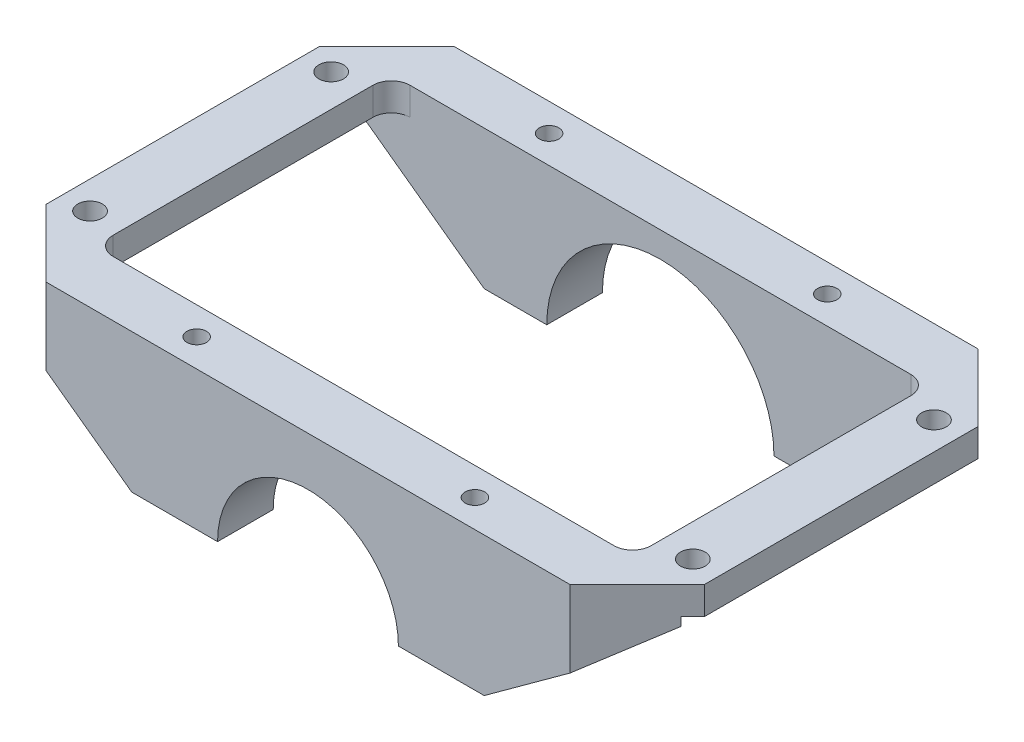
ISO-10303-21;
HEADER;
FILE_DESCRIPTION(('STEP AP214'),'2;1');
FILE_NAME('part.step','',(''),(''),'','','');
FILE_SCHEMA(('AUTOMOTIVE_DESIGN { 1 0 10303 214 1 1 1 1 }'));
ENDSEC;
DATA;
#1=APPLICATION_CONTEXT('core data for automotive mechanical design processes');
#2=APPLICATION_PROTOCOL_DEFINITION('international standard','automotive_design',2000,#1);
#3=PRODUCT_CONTEXT('',#1,'mechanical');
#4=PRODUCT('Part','Part','',(#3));
#5=PRODUCT_RELATED_PRODUCT_CATEGORY('part','',(#4));
#6=PRODUCT_DEFINITION_FORMATION('','',#4);
#7=PRODUCT_DEFINITION_CONTEXT('part definition',#1,'design');
#8=PRODUCT_DEFINITION('design','',#6,#7);
#9=PRODUCT_DEFINITION_SHAPE('','',#8);
#10=(LENGTH_UNIT() NAMED_UNIT(*) SI_UNIT(.MILLI.,.METRE.));
#11=(NAMED_UNIT(*) PLANE_ANGLE_UNIT() SI_UNIT($,.RADIAN.));
#12=(NAMED_UNIT(*) SI_UNIT($,.STERADIAN.) SOLID_ANGLE_UNIT());
#13=UNCERTAINTY_MEASURE_WITH_UNIT(LENGTH_MEASURE(1.E-05),#10,'distance_accuracy_value','');
#14=(GEOMETRIC_REPRESENTATION_CONTEXT(3) GLOBAL_UNCERTAINTY_ASSIGNED_CONTEXT((#13)) GLOBAL_UNIT_ASSIGNED_CONTEXT((#10,
#11,#12)) REPRESENTATION_CONTEXT('',''));
#15=CARTESIAN_POINT('',(0.,0.,0.));
#16=DIRECTION('',(0.,0.,1.));
#17=DIRECTION('',(1.,0.,0.));
#18=AXIS2_PLACEMENT_3D('',#15,#16,#17);
#19=CARTESIAN_POINT('',(-71.,-30.,44.));
#20=DIRECTION('',(0.,1.,0.));
#21=DIRECTION('',(0.,0.,1.));
#22=AXIS2_PLACEMENT_3D('',#19,#20,#21);
#23=PLANE('',#22);
#24=CARTESIAN_POINT('',(30.,-30.,-38.));
#25=DIRECTION('',(0.,1.,0.));
#26=DIRECTION('',(0.,0.,1.));
#27=AXIS2_PLACEMENT_3D('',#24,#25,#26);
#28=CIRCLE('',#27,2.09999999999999);
#29=CARTESIAN_POINT('',(30.,-30.,-35.9));
#30=VERTEX_POINT('',#29);
#31=EDGE_CURVE('E618',#30,#30,#28,.T.);
#32=ORIENTED_EDGE('',*,*,#31,.T.);
#33=EDGE_LOOP('',(#32));
#34=FACE_BOUND('',#33,.T.);
#35=DIRECTION('',(-1.,0.,0.));
#36=VECTOR('',#35,1.);
#37=CARTESIAN_POINT('',(-58.,-30.,-32.));
#38=LINE('',#37,#36);
#39=CARTESIAN_POINT('',(38.,-30.,-32.));
#40=VERTEX_POINT('',#39);
#41=CARTESIAN_POINT('',(24.5,-30.,-32.));
#42=VERTEX_POINT('',#41);
#43=EDGE_CURVE('E274',#40,#42,#38,.T.);
#44=ORIENTED_EDGE('',*,*,#43,.T.);
#45=DIRECTION('',(0.,0.,-1.));
#46=VECTOR('',#45,1.);
#47=CARTESIAN_POINT('',(24.5,-30.,44.001));
#48=LINE('',#47,#46);
#49=CARTESIAN_POINT('',(24.5,-30.,-44.));
#50=VERTEX_POINT('',#49);
#51=EDGE_CURVE('E59',#50,#42,#48,.F.);
#52=ORIENTED_EDGE('',*,*,#51,.F.);
#53=DIRECTION('',(-1.,0.,0.));
#54=VECTOR('',#53,1.);
#55=CARTESIAN_POINT('',(-71.,-30.,-44.));
#56=LINE('',#55,#54);
#57=CARTESIAN_POINT('',(38.,-30.,-44.));
#58=VERTEX_POINT('',#57);
#59=EDGE_CURVE('E272',#58,#50,#56,.T.);
#60=ORIENTED_EDGE('',*,*,#59,.F.);
#61=DIRECTION('',(0.,0.,1.));
#62=VECTOR('',#61,1.);
#63=CARTESIAN_POINT('',(38.,-30.,-44.));
#64=LINE('',#63,#62);
#65=EDGE_CURVE('E530',#58,#40,#64,.T.);
#66=ORIENTED_EDGE('',*,*,#65,.T.);
#67=EDGE_LOOP('',(#44,#52,#60,#66));
#68=FACE_BOUND('',#67,.T.);
#69=ADVANCED_FACE('F40',(#34,#68),#23,.F.);
#70=CARTESIAN_POINT('',(-30.,-30.,38.));
#71=DIRECTION('',(0.,1.,0.));
#72=DIRECTION('',(0.,0.,1.));
#73=AXIS2_PLACEMENT_3D('',#70,#71,#72);
#74=CIRCLE('',#73,2.09999999999999);
#75=CARTESIAN_POINT('',(-30.,-30.,40.1));
#76=VERTEX_POINT('',#75);
#77=EDGE_CURVE('E610',#76,#76,#74,.T.);
#78=ORIENTED_EDGE('',*,*,#77,.T.);
#79=EDGE_LOOP('',(#78));
#80=FACE_BOUND('',#79,.T.);
#81=DIRECTION('',(1.,0.,0.));
#82=VECTOR('',#81,1.);
#83=CARTESIAN_POINT('',(-58.,-30.,32.));
#84=LINE('',#83,#82);
#85=CARTESIAN_POINT('',(-38.,-30.,32.));
#86=VERTEX_POINT('',#85);
#87=CARTESIAN_POINT('',(-19.5,-30.,32.));
#88=VERTEX_POINT('',#87);
#89=EDGE_CURVE('E538',#86,#88,#84,.T.);
#90=ORIENTED_EDGE('',*,*,#89,.T.);
#91=DIRECTION('',(0.,0.,1.));
#92=VECTOR('',#91,1.);
#93=CARTESIAN_POINT('',(-19.5,-30.,-44.001));
#94=LINE('',#93,#92);
#95=CARTESIAN_POINT('',(-19.5,-30.,44.));
#96=VERTEX_POINT('',#95);
#97=EDGE_CURVE('E69',#96,#88,#94,.F.);
#98=ORIENTED_EDGE('',*,*,#97,.F.);
#99=DIRECTION('',(1.,0.,0.));
#100=VECTOR('',#99,1.);
#101=CARTESIAN_POINT('',(-71.,-30.,44.));
#102=LINE('',#101,#100);
#103=CARTESIAN_POINT('',(-38.,-30.,44.));
#104=VERTEX_POINT('',#103);
#105=EDGE_CURVE('E292',#104,#96,#102,.T.);
#106=ORIENTED_EDGE('',*,*,#105,.F.);
#107=DIRECTION('',(0.,0.,1.));
#108=VECTOR('',#107,1.);
#109=CARTESIAN_POINT('',(-38.,-30.,-44.));
#110=LINE('',#109,#108);
#111=EDGE_CURVE('E513',#86,#104,#110,.T.);
#112=ORIENTED_EDGE('',*,*,#111,.F.);
#113=EDGE_LOOP('',(#90,#98,#106,#112));
#114=FACE_BOUND('',#113,.T.);
#115=ADVANCED_FACE('F588',(#80,#114),#23,.F.);
#116=CARTESIAN_POINT('',(-58.,-30.,-32.));
#117=DIRECTION('',(-1.,0.,0.));
#118=DIRECTION('',(0.,0.,1.));
#119=AXIS2_PLACEMENT_3D('',#116,#117,#118);
#120=PLANE('',#119);
#121=DIRECTION('',(0.,0.,1.));
#122=VECTOR('',#121,1.);
#123=CARTESIAN_POINT('',(-58.,0.,-32.));
#124=LINE('',#123,#122);
#125=CARTESIAN_POINT('',(-58.,0.,-28.));
#126=VERTEX_POINT('',#125);
#127=CARTESIAN_POINT('',(-58.,0.,28.));
#128=VERTEX_POINT('',#127);
#129=EDGE_CURVE('E537',#126,#128,#124,.T.);
#130=ORIENTED_EDGE('',*,*,#129,.T.);
#131=DIRECTION('',(0.,1.,0.));
#132=VECTOR('',#131,1.);
#133=CARTESIAN_POINT('',(-58.,-6.00000000000001,28.));
#134=LINE('',#133,#132);
#135=CARTESIAN_POINT('',(-58.,-6.00000000000001,28.));
#136=VERTEX_POINT('',#135);
#137=EDGE_CURVE('E338',#128,#136,#134,.F.);
#138=ORIENTED_EDGE('',*,*,#137,.T.);
#139=DIRECTION('',(0.,0.,1.));
#140=VECTOR('',#139,1.);
#141=CARTESIAN_POINT('',(-58.,-6.00000000000001,-32.));
#142=LINE('',#141,#140);
#143=CARTESIAN_POINT('',(-58.,-6.00000000000001,-28.));
#144=VERTEX_POINT('',#143);
#145=EDGE_CURVE('E509',#144,#136,#142,.T.);
#146=ORIENTED_EDGE('',*,*,#145,.F.);
#147=DIRECTION('',(0.,1.,0.));
#148=VECTOR('',#147,1.);
#149=CARTESIAN_POINT('',(-58.,0.,-28.));
#150=LINE('',#149,#148);
#151=EDGE_CURVE('E335',#144,#126,#150,.T.);
#152=ORIENTED_EDGE('',*,*,#151,.T.);
#153=EDGE_LOOP('',(#130,#138,#146,#152));
#154=FACE_BOUND('',#153,.T.);
#155=ADVANCED_FACE('F688',(#154),#120,.F.);
#156=CARTESIAN_POINT('',(58.,-30.,-32.));
#157=DIRECTION('',(1.,0.,0.));
#158=DIRECTION('',(0.,0.,-1.));
#159=AXIS2_PLACEMENT_3D('',#156,#157,#158);
#160=PLANE('',#159);
#161=DIRECTION('',(0.,0.,-1.));
#162=VECTOR('',#161,1.);
#163=CARTESIAN_POINT('',(58.,-6.00000000000001,-32.));
#164=LINE('',#163,#162);
#165=CARTESIAN_POINT('',(58.,-6.00000000000001,28.));
#166=VERTEX_POINT('',#165);
#167=CARTESIAN_POINT('',(58.,-6.00000000000001,-28.));
#168=VERTEX_POINT('',#167);
#169=EDGE_CURVE('E501',#166,#168,#164,.T.);
#170=ORIENTED_EDGE('',*,*,#169,.F.);
#171=DIRECTION('',(0.,1.,0.));
#172=VECTOR('',#171,1.);
#173=CARTESIAN_POINT('',(58.,0.,28.));
#174=LINE('',#173,#172);
#175=CARTESIAN_POINT('',(58.,0.,28.));
#176=VERTEX_POINT('',#175);
#177=EDGE_CURVE('E317',#166,#176,#174,.T.);
#178=ORIENTED_EDGE('',*,*,#177,.T.);
#179=DIRECTION('',(0.,0.,-1.));
#180=VECTOR('',#179,1.);
#181=CARTESIAN_POINT('',(58.,0.,-32.));
#182=LINE('',#181,#180);
#183=CARTESIAN_POINT('',(58.,0.,-28.));
#184=VERTEX_POINT('',#183);
#185=EDGE_CURVE('E553',#176,#184,#182,.T.);
#186=ORIENTED_EDGE('',*,*,#185,.T.);
#187=DIRECTION('',(0.,1.,0.));
#188=VECTOR('',#187,1.);
#189=CARTESIAN_POINT('',(58.,-6.00000000000001,-28.));
#190=LINE('',#189,#188);
#191=EDGE_CURVE('E314',#184,#168,#190,.F.);
#192=ORIENTED_EDGE('',*,*,#191,.T.);
#193=EDGE_LOOP('',(#170,#178,#186,#192));
#194=FACE_BOUND('',#193,.T.);
#195=ADVANCED_FACE('F736',(#194),#160,.F.);
#196=CARTESIAN_POINT('',(-33.4843062845935,-81.9885863887953,-44.));
#197=DIRECTION('',(-0.588171697675047,0.808736084303188,0.));
#198=DIRECTION('',(-0.808736084303188,-0.588171697675047,0.));
#199=AXIS2_PLACEMENT_3D('',#196,#197,#198);
#200=PLANE('',#199);
#201=DIRECTION('',(-0.808736084303188,-0.588171697675047,0.));
#202=VECTOR('',#201,1.);
#203=CARTESIAN_POINT('',(-33.4843062845935,-81.9885863887953,-44.));
#204=LINE('',#203,#202);
#205=CARTESIAN_POINT('',(56.5,-16.5454545454546,-44.));
#206=VERTEX_POINT('',#205);
#207=EDGE_CURVE('E279',#206,#58,#204,.T.);
#208=ORIENTED_EDGE('',*,*,#207,.F.);
#209=DIRECTION('',(-0.628828145522533,-0.457329560380024,-0.628828145522532));
#210=VECTOR('',#209,1.);
#211=CARTESIAN_POINT('',(64.0980392156863,-11.0196078431373,-36.4019607843137));
#212=LINE('',#211,#210);
#213=CARTESIAN_POINT('',(68.4999999999999,-7.81818181818182,-32.));
#214=VERTEX_POINT('',#213);
#215=EDGE_CURVE('E406',#206,#214,#212,.F.);
#216=ORIENTED_EDGE('',*,*,#215,.T.);
#217=DIRECTION('',(0.808736084303188,0.588171697675047,0.));
#218=VECTOR('',#217,1.);
#219=CARTESIAN_POINT('',(-24.7891891891892,-75.6648648648649,-32.));
#220=LINE('',#219,#218);
#221=EDGE_CURVE('E533',#40,#214,#220,.T.);
#222=ORIENTED_EDGE('',*,*,#221,.F.);
#223=ORIENTED_EDGE('',*,*,#65,.F.);
#224=EDGE_LOOP('',(#208,#216,#222,#223));
#225=FACE_BOUND('',#224,.T.);
#226=ADVANCED_FACE('F606',(#225),#200,.F.);
#227=CARTESIAN_POINT('',(-71.,-6.,-44.));
#228=DIRECTION('',(-0.588171697675047,-0.808736084303189,0.));
#229=DIRECTION('',(0.808736084303188,-0.588171697675046,0.));
#230=AXIS2_PLACEMENT_3D('',#227,#228,#229);
#231=PLANE('',#230);
#232=DIRECTION('',(-0.808736084303188,0.588171697675046,0.));
#233=VECTOR('',#232,1.);
#234=CARTESIAN_POINT('',(-51.0810810810811,-20.4864864864865,-32.));
#235=LINE('',#234,#233);
#236=CARTESIAN_POINT('',(-38.,-30.,-32.));
#237=VERTEX_POINT('',#236);
#238=CARTESIAN_POINT('',(-68.4999999999999,-7.81818181818185,-32.));
#239=VERTEX_POINT('',#238);
#240=EDGE_CURVE('E520',#237,#239,#235,.T.);
#241=ORIENTED_EDGE('',*,*,#240,.T.);
#242=DIRECTION('',(-0.628828145522533,0.457329560380024,0.628828145522532));
#243=VECTOR('',#242,1.);
#244=CARTESIAN_POINT('',(-65.266339869281,-10.1699346405229,-35.2336601307189));
#245=LINE('',#244,#243);
#246=CARTESIAN_POINT('',(-56.4999999999999,-16.5454545454546,-44.));
#247=VERTEX_POINT('',#246);
#248=EDGE_CURVE('E11',#239,#247,#245,.F.);
#249=ORIENTED_EDGE('',*,*,#248,.T.);
#250=DIRECTION('',(0.808736084303188,-0.588171697675046,0.));
#251=VECTOR('',#250,1.);
#252=CARTESIAN_POINT('',(-71.,-6.,-44.));
#253=LINE('',#252,#251);
#254=CARTESIAN_POINT('',(-38.,-30.,-44.));
#255=VERTEX_POINT('',#254);
#256=EDGE_CURVE('E481',#247,#255,#253,.T.);
#257=ORIENTED_EDGE('',*,*,#256,.T.);
#258=EDGE_CURVE('E514',#255,#237,#110,.T.);
#259=ORIENTED_EDGE('',*,*,#258,.T.);
#260=EDGE_LOOP('',(#241,#249,#257,#259));
#261=FACE_BOUND('',#260,.T.);
#262=ADVANCED_FACE('F727',(#261),#231,.T.);
#263=CARTESIAN_POINT('',(-71.,-30.,-44.));
#264=DIRECTION('',(-1.,0.,0.));
#265=DIRECTION('',(0.,0.,1.));
#266=AXIS2_PLACEMENT_3D('',#263,#264,#265);
#267=PLANE('',#266);
#268=DIRECTION('',(0.,0.,1.));
#269=VECTOR('',#268,1.);
#270=CARTESIAN_POINT('',(-71.,-6.00000000000001,0.));
#271=LINE('',#270,#269);
#272=CARTESIAN_POINT('',(-71.,-6.00000000000001,-29.4999999999999));
#273=VERTEX_POINT('',#272);
#274=CARTESIAN_POINT('',(-71.,-6.00000000000001,29.4999999999999));
#275=VERTEX_POINT('',#274);
#276=EDGE_CURVE('E431',#273,#275,#271,.T.);
#277=ORIENTED_EDGE('',*,*,#276,.T.);
#278=DIRECTION('',(0.,1.,0.));
#279=VECTOR('',#278,1.);
#280=CARTESIAN_POINT('',(-71.,-30.,29.4999999999999));
#281=LINE('',#280,#279);
#282=CARTESIAN_POINT('',(-71.,0.,29.4999999999999));
#283=VERTEX_POINT('',#282);
#284=EDGE_CURVE('E418',#275,#283,#281,.T.);
#285=ORIENTED_EDGE('',*,*,#284,.T.);
#286=DIRECTION('',(0.,0.,1.));
#287=VECTOR('',#286,1.);
#288=CARTESIAN_POINT('',(-71.,0.,-44.));
#289=LINE('',#288,#287);
#290=CARTESIAN_POINT('',(-71.,0.,-29.4999999999999));
#291=VERTEX_POINT('',#290);
#292=EDGE_CURVE('E296',#291,#283,#289,.T.);
#293=ORIENTED_EDGE('',*,*,#292,.F.);
#294=DIRECTION('',(0.,-1.,0.));
#295=VECTOR('',#294,1.);
#296=CARTESIAN_POINT('',(-71.,-30.,-29.4999999999999));
#297=LINE('',#296,#295);
#298=EDGE_CURVE('E415',#291,#273,#297,.T.);
#299=ORIENTED_EDGE('',*,*,#298,.T.);
#300=EDGE_LOOP('',(#277,#285,#293,#299));
#301=FACE_BOUND('',#300,.T.);
#302=ADVANCED_FACE('F438',(#301),#267,.T.);
#303=CARTESIAN_POINT('',(-71.,-30.,-44.));
#304=DIRECTION('',(0.,0.,-1.));
#305=DIRECTION('',(-1.,0.,0.));
#306=AXIS2_PLACEMENT_3D('',#303,#304,#305);
#307=PLANE('',#306);
#308=CARTESIAN_POINT('',(0.,-30.,-44.));
#309=DIRECTION('',(0.,0.,-1.));
#310=DIRECTION('',(-1.,0.,0.));
#311=AXIS2_PLACEMENT_3D('',#308,#309,#310);
#312=CIRCLE('',#311,24.5);
#313=CARTESIAN_POINT('',(-24.5,-30.,-44.));
#314=VERTEX_POINT('',#313);
#315=EDGE_CURVE('E258',#314,#50,#312,.T.);
#316=ORIENTED_EDGE('',*,*,#315,.F.);
#317=EDGE_CURVE('E283',#314,#255,#56,.T.);
#318=ORIENTED_EDGE('',*,*,#317,.T.);
#319=ORIENTED_EDGE('',*,*,#256,.F.);
#320=DIRECTION('',(0.,1.,0.));
#321=VECTOR('',#320,1.);
#322=CARTESIAN_POINT('',(-56.4999999999999,-30.,-44.));
#323=LINE('',#322,#321);
#324=CARTESIAN_POINT('',(-56.4999999999999,0.,-44.));
#325=VERTEX_POINT('',#324);
#326=EDGE_CURVE('E400',#247,#325,#323,.T.);
#327=ORIENTED_EDGE('',*,*,#326,.T.);
#328=DIRECTION('',(-1.,0.,0.));
#329=VECTOR('',#328,1.);
#330=CARTESIAN_POINT('',(-71.,0.,-44.));
#331=LINE('',#330,#329);
#332=CARTESIAN_POINT('',(56.5,0.,-44.));
#333=VERTEX_POINT('',#332);
#334=EDGE_CURVE('E308',#333,#325,#331,.T.);
#335=ORIENTED_EDGE('',*,*,#334,.F.);
#336=DIRECTION('',(0.,-1.,0.));
#337=VECTOR('',#336,1.);
#338=CARTESIAN_POINT('',(56.5,-30.,-44.));
#339=LINE('',#338,#337);
#340=EDGE_CURVE('E403',#333,#206,#339,.T.);
#341=ORIENTED_EDGE('',*,*,#340,.T.);
#342=ORIENTED_EDGE('',*,*,#207,.T.);
#343=ORIENTED_EDGE('',*,*,#59,.T.);
#344=EDGE_LOOP('',(#316,#318,#319,#327,#335,#341,#342,#343));
#345=FACE_BOUND('',#344,.T.);
#346=ADVANCED_FACE('F277',(#345),#307,.T.);
#347=CARTESIAN_POINT('',(-71.,-30.,44.));
#348=DIRECTION('',(0.,0.,1.));
#349=DIRECTION('',(1.,0.,0.));
#350=AXIS2_PLACEMENT_3D('',#347,#348,#349);
#351=PLANE('',#350);
#352=CARTESIAN_POINT('',(0.,-30.,44.));
#353=DIRECTION('',(0.,0.,1.));
#354=DIRECTION('',(1.,0.,0.));
#355=AXIS2_PLACEMENT_3D('',#352,#353,#354);
#356=CIRCLE('',#355,19.5);
#357=CARTESIAN_POINT('',(19.5,-30.,44.));
#358=VERTEX_POINT('',#357);
#359=EDGE_CURVE('E584',#358,#96,#356,.T.);
#360=ORIENTED_EDGE('',*,*,#359,.F.);
#361=CARTESIAN_POINT('',(38.,-30.,44.));
#362=VERTEX_POINT('',#361);
#363=EDGE_CURVE('E311',#358,#362,#102,.T.);
#364=ORIENTED_EDGE('',*,*,#363,.T.);
#365=DIRECTION('',(-0.808736084303188,-0.588171697675047,0.));
#366=VECTOR('',#365,1.);
#367=CARTESIAN_POINT('',(-33.4843062845935,-81.9885863887953,44.));
#368=LINE('',#367,#366);
#369=CARTESIAN_POINT('',(56.4999999999999,-16.5454545454546,44.));
#370=VERTEX_POINT('',#369);
#371=EDGE_CURVE('E458',#370,#362,#368,.T.);
#372=ORIENTED_EDGE('',*,*,#371,.F.);
#373=DIRECTION('',(0.,1.,0.));
#374=VECTOR('',#373,1.);
#375=CARTESIAN_POINT('',(56.4999999999999,-30.,44.));
#376=LINE('',#375,#374);
#377=CARTESIAN_POINT('',(56.4999999999999,0.,44.));
#378=VERTEX_POINT('',#377);
#379=EDGE_CURVE('E364',#370,#378,#376,.T.);
#380=ORIENTED_EDGE('',*,*,#379,.T.);
#381=DIRECTION('',(1.,0.,0.));
#382=VECTOR('',#381,1.);
#383=CARTESIAN_POINT('',(-71.,0.,44.));
#384=LINE('',#383,#382);
#385=CARTESIAN_POINT('',(-56.4999999999999,0.,44.));
#386=VERTEX_POINT('',#385);
#387=EDGE_CURVE('E300',#386,#378,#384,.T.);
#388=ORIENTED_EDGE('',*,*,#387,.F.);
#389=DIRECTION('',(0.,-1.,0.));
#390=VECTOR('',#389,1.);
#391=CARTESIAN_POINT('',(-56.4999999999999,-30.,44.));
#392=LINE('',#391,#390);
#393=CARTESIAN_POINT('',(-56.4999999999999,-16.5454545454546,44.));
#394=VERTEX_POINT('',#393);
#395=EDGE_CURVE('E362',#386,#394,#392,.T.);
#396=ORIENTED_EDGE('',*,*,#395,.T.);
#397=DIRECTION('',(0.808736084303188,-0.588171697675046,0.));
#398=VECTOR('',#397,1.);
#399=CARTESIAN_POINT('',(-71.,-6.,44.));
#400=LINE('',#399,#398);
#401=EDGE_CURVE('E518',#394,#104,#400,.T.);
#402=ORIENTED_EDGE('',*,*,#401,.T.);
#403=ORIENTED_EDGE('',*,*,#105,.T.);
#404=EDGE_LOOP('',(#360,#364,#372,#380,#388,#396,#402,#403));
#405=FACE_BOUND('',#404,.T.);
#406=ADVANCED_FACE('F453',(#405),#351,.T.);
#407=CARTESIAN_POINT('',(-30.,-30.,-38.));
#408=DIRECTION('',(0.,1.,0.));
#409=DIRECTION('',(0.,0.,1.));
#410=AXIS2_PLACEMENT_3D('',#407,#408,#409);
#411=CIRCLE('',#410,2.09999999999999);
#412=CARTESIAN_POINT('',(-30.,-30.,-35.9));
#413=VERTEX_POINT('',#412);
#414=EDGE_CURVE('E625',#413,#413,#411,.T.);
#415=ORIENTED_EDGE('',*,*,#414,.T.);
#416=EDGE_LOOP('',(#415));
#417=FACE_BOUND('',#416,.T.);
#418=ORIENTED_EDGE('',*,*,#317,.F.);
#419=DIRECTION('',(0.,0.,-1.));
#420=VECTOR('',#419,1.);
#421=CARTESIAN_POINT('',(-24.5,-30.,44.001));
#422=LINE('',#421,#420);
#423=CARTESIAN_POINT('',(-24.5,-30.,-32.));
#424=VERTEX_POINT('',#423);
#425=EDGE_CURVE('E261',#424,#314,#422,.T.);
#426=ORIENTED_EDGE('',*,*,#425,.F.);
#427=EDGE_CURVE('E542',#424,#237,#38,.T.);
#428=ORIENTED_EDGE('',*,*,#427,.T.);
#429=ORIENTED_EDGE('',*,*,#258,.F.);
#430=EDGE_LOOP('',(#418,#426,#428,#429));
#431=FACE_BOUND('',#430,.T.);
#432=ADVANCED_FACE('F709',(#417,#431),#23,.F.);
#433=CARTESIAN_POINT('',(30.,-30.,38.));
#434=DIRECTION('',(0.,1.,0.));
#435=DIRECTION('',(0.,0.,1.));
#436=AXIS2_PLACEMENT_3D('',#433,#434,#435);
#437=CIRCLE('',#436,2.09999999999999);
#438=CARTESIAN_POINT('',(30.,-30.,40.1));
#439=VERTEX_POINT('',#438);
#440=EDGE_CURVE('E577',#439,#439,#437,.T.);
#441=ORIENTED_EDGE('',*,*,#440,.T.);
#442=EDGE_LOOP('',(#441));
#443=FACE_BOUND('',#442,.T.);
#444=ORIENTED_EDGE('',*,*,#363,.F.);
#445=DIRECTION('',(0.,0.,1.));
#446=VECTOR('',#445,1.);
#447=CARTESIAN_POINT('',(19.5,-30.,-44.001));
#448=LINE('',#447,#446);
#449=CARTESIAN_POINT('',(19.5,-30.,32.));
#450=VERTEX_POINT('',#449);
#451=EDGE_CURVE('E569',#450,#358,#448,.T.);
#452=ORIENTED_EDGE('',*,*,#451,.F.);
#453=CARTESIAN_POINT('',(38.,-30.,32.));
#454=VERTEX_POINT('',#453);
#455=EDGE_CURVE('E543',#450,#454,#84,.T.);
#456=ORIENTED_EDGE('',*,*,#455,.T.);
#457=EDGE_CURVE('E527',#454,#362,#64,.T.);
#458=ORIENTED_EDGE('',*,*,#457,.T.);
#459=EDGE_LOOP('',(#444,#452,#456,#458));
#460=FACE_BOUND('',#459,.T.);
#461=ADVANCED_FACE('F567',(#443,#460),#23,.F.);
#462=CARTESIAN_POINT('',(-58.,-30.,-32.));
#463=DIRECTION('',(0.,0.,-1.));
#464=DIRECTION('',(-1.,0.,0.));
#465=AXIS2_PLACEMENT_3D('',#462,#463,#464);
#466=PLANE('',#465);
#467=ORIENTED_EDGE('',*,*,#427,.F.);
#468=CARTESIAN_POINT('',(0.,-30.,-32.));
#469=DIRECTION('',(0.,0.,-1.));
#470=DIRECTION('',(-1.,0.,0.));
#471=AXIS2_PLACEMENT_3D('',#468,#469,#470);
#472=CIRCLE('',#471,24.5);
#473=EDGE_CURVE('E266',#42,#424,#472,.F.);
#474=ORIENTED_EDGE('',*,*,#473,.F.);
#475=ORIENTED_EDGE('',*,*,#43,.F.);
#476=ORIENTED_EDGE('',*,*,#221,.T.);
#477=DIRECTION('',(0.,-1.,0.));
#478=VECTOR('',#477,1.);
#479=CARTESIAN_POINT('',(68.4999999999999,-30.,-32.));
#480=LINE('',#479,#478);
#481=CARTESIAN_POINT('',(68.4999999999999,-6.00000000000001,-32.));
#482=VERTEX_POINT('',#481);
#483=EDGE_CURVE('E412',#214,#482,#480,.F.);
#484=ORIENTED_EDGE('',*,*,#483,.T.);
#485=DIRECTION('',(-1.,0.,0.));
#486=VECTOR('',#485,1.);
#487=CARTESIAN_POINT('',(71.,-6.00000000000001,-32.));
#488=LINE('',#487,#486);
#489=CARTESIAN_POINT('',(54.,-6.00000000000001,-32.));
#490=VERTEX_POINT('',#489);
#491=EDGE_CURVE('E496',#482,#490,#488,.T.);
#492=ORIENTED_EDGE('',*,*,#491,.T.);
#493=DIRECTION('',(0.,1.,0.));
#494=VECTOR('',#493,1.);
#495=CARTESIAN_POINT('',(54.,0.,-32.));
#496=LINE('',#495,#494);
#497=CARTESIAN_POINT('',(54.,0.,-32.));
#498=VERTEX_POINT('',#497);
#499=EDGE_CURVE('E331',#490,#498,#496,.T.);
#500=ORIENTED_EDGE('',*,*,#499,.T.);
#501=DIRECTION('',(-1.,0.,0.));
#502=VECTOR('',#501,1.);
#503=CARTESIAN_POINT('',(-58.,0.,-32.));
#504=LINE('',#503,#502);
#505=CARTESIAN_POINT('',(-54.,0.,-32.));
#506=VERTEX_POINT('',#505);
#507=EDGE_CURVE('E556',#498,#506,#504,.T.);
#508=ORIENTED_EDGE('',*,*,#507,.T.);
#509=DIRECTION('',(0.,1.,0.));
#510=VECTOR('',#509,1.);
#511=CARTESIAN_POINT('',(-54.,-6.00000000000001,-32.));
#512=LINE('',#511,#510);
#513=CARTESIAN_POINT('',(-54.,-6.00000000000001,-32.));
#514=VERTEX_POINT('',#513);
#515=EDGE_CURVE('E328',#506,#514,#512,.F.);
#516=ORIENTED_EDGE('',*,*,#515,.T.);
#517=CARTESIAN_POINT('',(-68.4999999999999,-6.00000000000001,-32.));
#518=VERTEX_POINT('',#517);
#519=EDGE_CURVE('E486',#514,#518,#488,.T.);
#520=ORIENTED_EDGE('',*,*,#519,.T.);
#521=DIRECTION('',(0.,1.,0.));
#522=VECTOR('',#521,1.);
#523=CARTESIAN_POINT('',(-68.4999999999999,-30.,-32.));
#524=LINE('',#523,#522);
#525=EDGE_CURVE('E409',#518,#239,#524,.F.);
#526=ORIENTED_EDGE('',*,*,#525,.T.);
#527=ORIENTED_EDGE('',*,*,#240,.F.);
#528=EDGE_LOOP('',(#467,#474,#475,#476,#484,#492,#500,#508,#516,#520,#526,#527));
#529=FACE_BOUND('',#528,.T.);
#530=ADVANCED_FACE('F489',(#529),#466,.F.);
#531=CARTESIAN_POINT('',(-58.,-30.,32.));
#532=DIRECTION('',(0.,0.,1.));
#533=DIRECTION('',(1.,0.,0.));
#534=AXIS2_PLACEMENT_3D('',#531,#532,#533);
#535=PLANE('',#534);
#536=ORIENTED_EDGE('',*,*,#455,.F.);
#537=CARTESIAN_POINT('',(0.,-30.,32.));
#538=DIRECTION('',(0.,0.,1.));
#539=DIRECTION('',(1.,0.,0.));
#540=AXIS2_PLACEMENT_3D('',#537,#538,#539);
#541=CIRCLE('',#540,19.5);
#542=EDGE_CURVE('E443',#88,#450,#541,.F.);
#543=ORIENTED_EDGE('',*,*,#542,.F.);
#544=ORIENTED_EDGE('',*,*,#89,.F.);
#545=DIRECTION('',(0.808736084303188,-0.588171697675046,0.));
#546=VECTOR('',#545,1.);
#547=CARTESIAN_POINT('',(-51.0810810810811,-20.4864864864865,32.));
#548=LINE('',#547,#546);
#549=CARTESIAN_POINT('',(-68.4999999999999,-7.81818181818185,32.));
#550=VERTEX_POINT('',#549);
#551=EDGE_CURVE('E289',#550,#86,#548,.T.);
#552=ORIENTED_EDGE('',*,*,#551,.F.);
#553=DIRECTION('',(0.,-1.,0.));
#554=VECTOR('',#553,1.);
#555=CARTESIAN_POINT('',(-68.4999999999999,-30.,32.));
#556=LINE('',#555,#554);
#557=CARTESIAN_POINT('',(-68.4999999999999,-6.00000000000001,32.));
#558=VERTEX_POINT('',#557);
#559=EDGE_CURVE('E392',#550,#558,#556,.F.);
#560=ORIENTED_EDGE('',*,*,#559,.T.);
#561=DIRECTION('',(-1.,0.,0.));
#562=VECTOR('',#561,1.);
#563=CARTESIAN_POINT('',(71.,-6.00000000000001,32.));
#564=LINE('',#563,#562);
#565=CARTESIAN_POINT('',(-54.,-6.00000000000001,32.));
#566=VERTEX_POINT('',#565);
#567=EDGE_CURVE('E433',#566,#558,#564,.T.);
#568=ORIENTED_EDGE('',*,*,#567,.F.);
#569=DIRECTION('',(0.,1.,0.));
#570=VECTOR('',#569,1.);
#571=CARTESIAN_POINT('',(-54.,0.,32.));
#572=LINE('',#571,#570);
#573=CARTESIAN_POINT('',(-54.,0.,32.));
#574=VERTEX_POINT('',#573);
#575=EDGE_CURVE('E321',#566,#574,#572,.T.);
#576=ORIENTED_EDGE('',*,*,#575,.T.);
#577=DIRECTION('',(1.,0.,0.));
#578=VECTOR('',#577,1.);
#579=CARTESIAN_POINT('',(-58.,0.,32.));
#580=LINE('',#579,#578);
#581=CARTESIAN_POINT('',(54.,0.,32.));
#582=VERTEX_POINT('',#581);
#583=EDGE_CURVE('E549',#574,#582,#580,.T.);
#584=ORIENTED_EDGE('',*,*,#583,.T.);
#585=DIRECTION('',(0.,1.,0.));
#586=VECTOR('',#585,1.);
#587=CARTESIAN_POINT('',(54.,-6.00000000000001,32.));
#588=LINE('',#587,#586);
#589=CARTESIAN_POINT('',(54.,-6.00000000000001,32.));
#590=VERTEX_POINT('',#589);
#591=EDGE_CURVE('E324',#582,#590,#588,.F.);
#592=ORIENTED_EDGE('',*,*,#591,.T.);
#593=CARTESIAN_POINT('',(68.4999999999999,-6.00000000000001,32.));
#594=VERTEX_POINT('',#593);
#595=EDGE_CURVE('E497',#594,#590,#564,.T.);
#596=ORIENTED_EDGE('',*,*,#595,.F.);
#597=DIRECTION('',(0.,1.,0.));
#598=VECTOR('',#597,1.);
#599=CARTESIAN_POINT('',(68.4999999999999,-30.,32.));
#600=LINE('',#599,#598);
#601=CARTESIAN_POINT('',(68.4999999999999,-7.81818181818185,32.));
#602=VERTEX_POINT('',#601);
#603=EDGE_CURVE('E394',#594,#602,#600,.F.);
#604=ORIENTED_EDGE('',*,*,#603,.T.);
#605=DIRECTION('',(-0.808736084303188,-0.588171697675047,0.));
#606=VECTOR('',#605,1.);
#607=CARTESIAN_POINT('',(-24.7891891891891,-75.6648648648649,32.));
#608=LINE('',#607,#606);
#609=EDGE_CURVE('E282',#602,#454,#608,.T.);
#610=ORIENTED_EDGE('',*,*,#609,.T.);
#611=EDGE_LOOP('',(#536,#543,#544,#552,#560,#568,#576,#584,#592,#596,#604,#610));
#612=FACE_BOUND('',#611,.T.);
#613=ADVANCED_FACE('F572',(#612),#535,.F.);
#614=CARTESIAN_POINT('',(71.,-30.,-44.));
#615=DIRECTION('',(1.,0.,0.));
#616=DIRECTION('',(0.,0.,-1.));
#617=AXIS2_PLACEMENT_3D('',#614,#615,#616);
#618=PLANE('',#617);
#619=DIRECTION('',(0.,0.,-1.));
#620=VECTOR('',#619,1.);
#621=CARTESIAN_POINT('',(71.,0.,-44.));
#622=LINE('',#621,#620);
#623=CARTESIAN_POINT('',(71.,0.,29.4999999999999));
#624=VERTEX_POINT('',#623);
#625=CARTESIAN_POINT('',(71.,0.,-29.5));
#626=VERTEX_POINT('',#625);
#627=EDGE_CURVE('E304',#624,#626,#622,.T.);
#628=ORIENTED_EDGE('',*,*,#627,.F.);
#629=DIRECTION('',(0.,-1.,0.));
#630=VECTOR('',#629,1.);
#631=CARTESIAN_POINT('',(71.,-30.,29.4999999999999));
#632=LINE('',#631,#630);
#633=CARTESIAN_POINT('',(71.,-6.00000000000001,29.4999999999999));
#634=VERTEX_POINT('',#633);
#635=EDGE_CURVE('E383',#624,#634,#632,.T.);
#636=ORIENTED_EDGE('',*,*,#635,.T.);
#637=DIRECTION('',(0.,0.,1.));
#638=VECTOR('',#637,1.);
#639=CARTESIAN_POINT('',(71.,-6.00000000000001,0.));
#640=LINE('',#639,#638);
#641=CARTESIAN_POINT('',(71.,-6.00000000000001,-29.5));
#642=VERTEX_POINT('',#641);
#643=EDGE_CURVE('E442',#642,#634,#640,.T.);
#644=ORIENTED_EDGE('',*,*,#643,.F.);
#645=DIRECTION('',(0.,1.,0.));
#646=VECTOR('',#645,1.);
#647=CARTESIAN_POINT('',(71.,-30.,-29.5));
#648=LINE('',#647,#646);
#649=EDGE_CURVE('E379',#642,#626,#648,.T.);
#650=ORIENTED_EDGE('',*,*,#649,.T.);
#651=EDGE_LOOP('',(#628,#636,#644,#650));
#652=FACE_BOUND('',#651,.T.);
#653=ADVANCED_FACE('F467',(#652),#618,.T.);
#654=CARTESIAN_POINT('',(-71.,0.,44.));
#655=DIRECTION('',(0.,1.,0.));
#656=DIRECTION('',(0.,0.,1.));
#657=AXIS2_PLACEMENT_3D('',#654,#655,#656);
#658=PLANE('',#657);
#659=CARTESIAN_POINT('',(-65.,0.,-26.));
#660=DIRECTION('',(0.,1.,0.));
#661=DIRECTION('',(0.,0.,1.));
#662=AXIS2_PLACEMENT_3D('',#659,#660,#661);
#663=CIRCLE('',#662,2.65);
#664=CARTESIAN_POINT('',(-65.,0.,-23.35));
#665=VERTEX_POINT('',#664);
#666=EDGE_CURVE('E659',#665,#665,#663,.T.);
#667=ORIENTED_EDGE('',*,*,#666,.F.);
#668=EDGE_LOOP('',(#667));
#669=FACE_BOUND('',#668,.T.);
#670=CARTESIAN_POINT('',(65.,0.,-26.));
#671=DIRECTION('',(0.,1.,0.));
#672=DIRECTION('',(0.,0.,1.));
#673=AXIS2_PLACEMENT_3D('',#670,#671,#672);
#674=CIRCLE('',#673,2.65);
#675=CARTESIAN_POINT('',(65.,0.,-23.35));
#676=VERTEX_POINT('',#675);
#677=EDGE_CURVE('E652',#676,#676,#674,.T.);
#678=ORIENTED_EDGE('',*,*,#677,.F.);
#679=EDGE_LOOP('',(#678));
#680=FACE_BOUND('',#679,.T.);
#681=CARTESIAN_POINT('',(-65.,0.,26.));
#682=DIRECTION('',(0.,1.,0.));
#683=DIRECTION('',(0.,0.,1.));
#684=AXIS2_PLACEMENT_3D('',#681,#682,#683);
#685=CIRCLE('',#684,2.65);
#686=CARTESIAN_POINT('',(-65.,0.,28.65));
#687=VERTEX_POINT('',#686);
#688=EDGE_CURVE('E645',#687,#687,#685,.T.);
#689=ORIENTED_EDGE('',*,*,#688,.F.);
#690=EDGE_LOOP('',(#689));
#691=FACE_BOUND('',#690,.T.);
#692=CARTESIAN_POINT('',(65.,0.,26.));
#693=DIRECTION('',(0.,1.,0.));
#694=DIRECTION('',(0.,0.,1.));
#695=AXIS2_PLACEMENT_3D('',#692,#693,#694);
#696=CIRCLE('',#695,2.65);
#697=CARTESIAN_POINT('',(65.,0.,28.65));
#698=VERTEX_POINT('',#697);
#699=EDGE_CURVE('E637',#698,#698,#696,.T.);
#700=ORIENTED_EDGE('',*,*,#699,.F.);
#701=EDGE_LOOP('',(#700));
#702=FACE_BOUND('',#701,.T.);
#703=CARTESIAN_POINT('',(-30.,0.,-38.));
#704=DIRECTION('',(0.,1.,0.));
#705=DIRECTION('',(0.,0.,1.));
#706=AXIS2_PLACEMENT_3D('',#703,#704,#705);
#707=CIRCLE('',#706,2.09999999999999);
#708=CARTESIAN_POINT('',(-30.,0.,-35.9));
#709=VERTEX_POINT('',#708);
#710=EDGE_CURVE('E629',#709,#709,#707,.T.);
#711=ORIENTED_EDGE('',*,*,#710,.F.);
#712=EDGE_LOOP('',(#711));
#713=FACE_BOUND('',#712,.T.);
#714=CARTESIAN_POINT('',(30.,0.,-38.));
#715=DIRECTION('',(0.,1.,0.));
#716=DIRECTION('',(0.,0.,1.));
#717=AXIS2_PLACEMENT_3D('',#714,#715,#716);
#718=CIRCLE('',#717,2.09999999999999);
#719=CARTESIAN_POINT('',(30.,0.,-35.9));
#720=VERTEX_POINT('',#719);
#721=EDGE_CURVE('E621',#720,#720,#718,.T.);
#722=ORIENTED_EDGE('',*,*,#721,.F.);
#723=EDGE_LOOP('',(#722));
#724=FACE_BOUND('',#723,.T.);
#725=CARTESIAN_POINT('',(30.,0.,38.));
#726=DIRECTION('',(0.,1.,0.));
#727=DIRECTION('',(0.,0.,1.));
#728=AXIS2_PLACEMENT_3D('',#725,#726,#727);
#729=CIRCLE('',#728,2.09999999999998);
#730=CARTESIAN_POINT('',(30.,0.,40.1));
#731=VERTEX_POINT('',#730);
#732=EDGE_CURVE('E580',#731,#731,#729,.T.);
#733=ORIENTED_EDGE('',*,*,#732,.F.);
#734=EDGE_LOOP('',(#733));
#735=FACE_BOUND('',#734,.T.);
#736=CARTESIAN_POINT('',(-30.,0.,38.));
#737=DIRECTION('',(0.,1.,0.));
#738=DIRECTION('',(0.,0.,1.));
#739=AXIS2_PLACEMENT_3D('',#736,#737,#738);
#740=CIRCLE('',#739,2.09999999999999);
#741=CARTESIAN_POINT('',(-30.,0.,40.1));
#742=VERTEX_POINT('',#741);
#743=EDGE_CURVE('E579',#742,#742,#740,.T.);
#744=ORIENTED_EDGE('',*,*,#743,.F.);
#745=EDGE_LOOP('',(#744));
#746=FACE_BOUND('',#745,.T.);
#747=ORIENTED_EDGE('',*,*,#129,.F.);
#748=CARTESIAN_POINT('',(-54.,0.,-28.));
#749=DIRECTION('',(0.,1.,0.));
#750=DIRECTION('',(0.,0.,1.));
#751=AXIS2_PLACEMENT_3D('',#748,#749,#750);
#752=CIRCLE('',#751,4.);
#753=EDGE_CURVE('E358',#126,#506,#752,.F.);
#754=ORIENTED_EDGE('',*,*,#753,.T.);
#755=ORIENTED_EDGE('',*,*,#507,.F.);
#756=CARTESIAN_POINT('',(54.,0.,-28.));
#757=DIRECTION('',(0.,1.,0.));
#758=DIRECTION('',(0.,0.,1.));
#759=AXIS2_PLACEMENT_3D('',#756,#757,#758);
#760=CIRCLE('',#759,4.);
#761=EDGE_CURVE('E346',#498,#184,#760,.F.);
#762=ORIENTED_EDGE('',*,*,#761,.T.);
#763=ORIENTED_EDGE('',*,*,#185,.F.);
#764=CARTESIAN_POINT('',(54.,0.,28.));
#765=DIRECTION('',(0.,1.,0.));
#766=DIRECTION('',(0.,0.,1.));
#767=AXIS2_PLACEMENT_3D('',#764,#765,#766);
#768=CIRCLE('',#767,4.);
#769=EDGE_CURVE('E340',#176,#582,#768,.F.);
#770=ORIENTED_EDGE('',*,*,#769,.T.);
#771=ORIENTED_EDGE('',*,*,#583,.F.);
#772=CARTESIAN_POINT('',(-54.,0.,28.));
#773=DIRECTION('',(0.,1.,0.));
#774=DIRECTION('',(0.,0.,1.));
#775=AXIS2_PLACEMENT_3D('',#772,#773,#774);
#776=CIRCLE('',#775,4.);
#777=EDGE_CURVE('E353',#574,#128,#776,.F.);
#778=ORIENTED_EDGE('',*,*,#777,.T.);
#779=EDGE_LOOP('',(#747,#754,#755,#762,#763,#770,#771,#778));
#780=FACE_BOUND('',#779,.T.);
#781=ORIENTED_EDGE('',*,*,#387,.T.);
#782=DIRECTION('',(-0.707106781186548,0.,0.707106781186547));
#783=VECTOR('',#782,1.);
#784=CARTESIAN_POINT('',(-7.25000000000012,0.,107.75));
#785=LINE('',#784,#783);
#786=EDGE_CURVE('E376',#378,#624,#785,.F.);
#787=ORIENTED_EDGE('',*,*,#786,.T.);
#788=ORIENTED_EDGE('',*,*,#627,.T.);
#789=DIRECTION('',(0.707106781186548,0.,0.707106781186547));
#790=VECTOR('',#789,1.);
#791=CARTESIAN_POINT('',(36.7499999999999,0.,-63.75));
#792=LINE('',#791,#790);
#793=EDGE_CURVE('E373',#626,#333,#792,.F.);
#794=ORIENTED_EDGE('',*,*,#793,.T.);
#795=ORIENTED_EDGE('',*,*,#334,.T.);
#796=DIRECTION('',(0.707106781186548,0.,-0.707106781186547));
#797=VECTOR('',#796,1.);
#798=CARTESIAN_POINT('',(-107.75,0.,7.25000000000001));
#799=LINE('',#798,#797);
#800=EDGE_CURVE('E368',#325,#291,#799,.F.);
#801=ORIENTED_EDGE('',*,*,#800,.T.);
#802=ORIENTED_EDGE('',*,*,#292,.T.);
#803=DIRECTION('',(-0.707106781186548,0.,-0.707106781186548));
#804=VECTOR('',#803,1.);
#805=CARTESIAN_POINT('',(-63.7499999999999,0.,36.75));
#806=LINE('',#805,#804);
#807=EDGE_CURVE('E371',#283,#386,#806,.F.);
#808=ORIENTED_EDGE('',*,*,#807,.T.);
#809=EDGE_LOOP('',(#781,#787,#788,#794,#795,#801,#802,#808));
#810=FACE_BOUND('',#809,.T.);
#811=ADVANCED_FACE('F450',(#669,#680,#691,#702,#713,#724,#735,#746,#780,#810),#658,.T.);
#812=ORIENTED_EDGE('',*,*,#609,.F.);
#813=DIRECTION('',(0.628828145522533,0.457329560380024,-0.628828145522532));
#814=VECTOR('',#813,1.);
#815=CARTESIAN_POINT('',(52.6307189542483,-19.3594771241831,47.8692810457516));
#816=LINE('',#815,#814);
#817=EDGE_CURVE('E397',#602,#370,#816,.F.);
#818=ORIENTED_EDGE('',*,*,#817,.T.);
#819=ORIENTED_EDGE('',*,*,#371,.T.);
#820=ORIENTED_EDGE('',*,*,#457,.F.);
#821=EDGE_LOOP('',(#812,#818,#819,#820));
#822=FACE_BOUND('',#821,.T.);
#823=ADVANCED_FACE('F575',(#822),#200,.F.);
#824=ORIENTED_EDGE('',*,*,#401,.F.);
#825=DIRECTION('',(0.628828145522532,-0.457329560380024,0.628828145522532));
#826=VECTOR('',#825,1.);
#827=CARTESIAN_POINT('',(-100.063725490196,15.1372549019608,0.436274509803908));
#828=LINE('',#827,#826);
#829=EDGE_CURVE('E421',#394,#550,#828,.F.);
#830=ORIENTED_EDGE('',*,*,#829,.T.);
#831=ORIENTED_EDGE('',*,*,#551,.T.);
#832=ORIENTED_EDGE('',*,*,#111,.T.);
#833=EDGE_LOOP('',(#824,#830,#831,#832));
#834=FACE_BOUND('',#833,.T.);
#835=ADVANCED_FACE('F730',(#834),#231,.T.);
#836=CARTESIAN_POINT('',(71.,-6.00000000000001,0.));
#837=DIRECTION('',(0.,-1.,0.));
#838=DIRECTION('',(0.,0.,-1.));
#839=AXIS2_PLACEMENT_3D('',#836,#837,#838);
#840=PLANE('',#839);
#841=CARTESIAN_POINT('',(-65.,-6.00000000000001,-26.));
#842=DIRECTION('',(0.,-1.,0.));
#843=DIRECTION('',(0.,0.,-1.));
#844=AXIS2_PLACEMENT_3D('',#841,#842,#843);
#845=CIRCLE('',#844,2.65);
#846=CARTESIAN_POINT('',(-65.,-6.00000000000001,-28.65));
#847=VERTEX_POINT('',#846);
#848=EDGE_CURVE('E656',#847,#847,#845,.T.);
#849=ORIENTED_EDGE('',*,*,#848,.F.);
#850=EDGE_LOOP('',(#849));
#851=FACE_BOUND('',#850,.T.);
#852=CARTESIAN_POINT('',(-65.,-6.00000000000001,26.));
#853=DIRECTION('',(0.,-1.,0.));
#854=DIRECTION('',(0.,0.,-1.));
#855=AXIS2_PLACEMENT_3D('',#852,#853,#854);
#856=CIRCLE('',#855,2.65);
#857=CARTESIAN_POINT('',(-65.,-6.00000000000001,23.35));
#858=VERTEX_POINT('',#857);
#859=EDGE_CURVE('E641',#858,#858,#856,.T.);
#860=ORIENTED_EDGE('',*,*,#859,.F.);
#861=EDGE_LOOP('',(#860));
#862=FACE_BOUND('',#861,.T.);
#863=ORIENTED_EDGE('',*,*,#567,.T.);
#864=DIRECTION('',(0.707106781186548,0.,0.707106781186548));
#865=VECTOR('',#864,1.);
#866=CARTESIAN_POINT('',(-14.7499999999999,-6.00000000000001,85.75));
#867=LINE('',#866,#865);
#868=EDGE_CURVE('E49',#558,#275,#867,.F.);
#869=ORIENTED_EDGE('',*,*,#868,.T.);
#870=ORIENTED_EDGE('',*,*,#276,.F.);
#871=DIRECTION('',(-0.707106781186548,0.,0.707106781186547));
#872=VECTOR('',#871,1.);
#873=CARTESIAN_POINT('',(-14.7499999999999,-6.00000000000001,-85.75));
#874=LINE('',#873,#872);
#875=EDGE_CURVE('E423',#273,#518,#874,.F.);
#876=ORIENTED_EDGE('',*,*,#875,.T.);
#877=ORIENTED_EDGE('',*,*,#519,.F.);
#878=CARTESIAN_POINT('',(-54.,-6.00000000000001,-28.));
#879=DIRECTION('',(0.,-1.,0.));
#880=DIRECTION('',(0.,0.,-1.));
#881=AXIS2_PLACEMENT_3D('',#878,#879,#880);
#882=CIRCLE('',#881,4.);
#883=EDGE_CURVE('E360',#514,#144,#882,.F.);
#884=ORIENTED_EDGE('',*,*,#883,.T.);
#885=ORIENTED_EDGE('',*,*,#145,.T.);
#886=CARTESIAN_POINT('',(-54.,-6.00000000000001,28.));
#887=DIRECTION('',(0.,-1.,0.));
#888=DIRECTION('',(0.,0.,-1.));
#889=AXIS2_PLACEMENT_3D('',#886,#887,#888);
#890=CIRCLE('',#889,4.);
#891=EDGE_CURVE('E355',#136,#566,#890,.F.);
#892=ORIENTED_EDGE('',*,*,#891,.T.);
#893=EDGE_LOOP('',(#863,#869,#870,#876,#877,#884,#885,#892));
#894=FACE_BOUND('',#893,.T.);
#895=ADVANCED_FACE('F430',(#851,#862,#894),#840,.T.);
#896=CARTESIAN_POINT('',(65.,-6.00000000000001,-26.));
#897=DIRECTION('',(0.,-1.,0.));
#898=DIRECTION('',(0.,0.,-1.));
#899=AXIS2_PLACEMENT_3D('',#896,#897,#898);
#900=CIRCLE('',#899,2.65);
#901=CARTESIAN_POINT('',(65.,-6.00000000000001,-28.65));
#902=VERTEX_POINT('',#901);
#903=EDGE_CURVE('E648',#902,#902,#900,.T.);
#904=ORIENTED_EDGE('',*,*,#903,.F.);
#905=EDGE_LOOP('',(#904));
#906=FACE_BOUND('',#905,.T.);
#907=CARTESIAN_POINT('',(65.,-6.00000000000001,26.));
#908=DIRECTION('',(0.,-1.,0.));
#909=DIRECTION('',(0.,0.,-1.));
#910=AXIS2_PLACEMENT_3D('',#907,#908,#909);
#911=CIRCLE('',#910,2.65);
#912=CARTESIAN_POINT('',(65.,-6.00000000000001,23.35));
#913=VERTEX_POINT('',#912);
#914=EDGE_CURVE('E633',#913,#913,#911,.T.);
#915=ORIENTED_EDGE('',*,*,#914,.F.);
#916=EDGE_LOOP('',(#915));
#917=FACE_BOUND('',#916,.T.);
#918=ORIENTED_EDGE('',*,*,#643,.T.);
#919=DIRECTION('',(0.707106781186548,0.,-0.707106781186547));
#920=VECTOR('',#919,1.);
#921=CARTESIAN_POINT('',(85.7499999999999,-6.00000000000001,14.75));
#922=LINE('',#921,#920);
#923=EDGE_CURVE('E389',#634,#594,#922,.F.);
#924=ORIENTED_EDGE('',*,*,#923,.T.);
#925=ORIENTED_EDGE('',*,*,#595,.T.);
#926=CARTESIAN_POINT('',(54.,-6.00000000000001,28.));
#927=DIRECTION('',(0.,-1.,0.));
#928=DIRECTION('',(0.,0.,-1.));
#929=AXIS2_PLACEMENT_3D('',#926,#927,#928);
#930=CIRCLE('',#929,4.);
#931=EDGE_CURVE('E343',#590,#166,#930,.F.);
#932=ORIENTED_EDGE('',*,*,#931,.T.);
#933=ORIENTED_EDGE('',*,*,#169,.T.);
#934=CARTESIAN_POINT('',(54.,-6.00000000000001,-28.));
#935=DIRECTION('',(0.,-1.,0.));
#936=DIRECTION('',(0.,0.,-1.));
#937=AXIS2_PLACEMENT_3D('',#934,#935,#936);
#938=CIRCLE('',#937,4.);
#939=EDGE_CURVE('E349',#168,#490,#938,.F.);
#940=ORIENTED_EDGE('',*,*,#939,.T.);
#941=ORIENTED_EDGE('',*,*,#491,.F.);
#942=DIRECTION('',(-0.707106781186548,0.,-0.707106781186547));
#943=VECTOR('',#942,1.);
#944=CARTESIAN_POINT('',(85.75,-6.00000000000001,-14.75));
#945=LINE('',#944,#943);
#946=EDGE_CURVE('E386',#482,#642,#945,.F.);
#947=ORIENTED_EDGE('',*,*,#946,.T.);
#948=EDGE_LOOP('',(#918,#924,#925,#932,#933,#940,#941,#947));
#949=FACE_BOUND('',#948,.T.);
#950=ADVANCED_FACE('F601',(#906,#917,#949),#840,.T.);
#951=CARTESIAN_POINT('',(54.,-30.,28.));
#952=DIRECTION('',(0.,-1.,0.));
#953=DIRECTION('',(0.,0.,-1.));
#954=AXIS2_PLACEMENT_3D('',#951,#952,#953);
#955=CYLINDRICAL_SURFACE('',#954,4.);
#956=ORIENTED_EDGE('',*,*,#931,.F.);
#957=ORIENTED_EDGE('',*,*,#591,.F.);
#958=ORIENTED_EDGE('',*,*,#769,.F.);
#959=ORIENTED_EDGE('',*,*,#177,.F.);
#960=EDGE_LOOP('',(#956,#957,#958,#959));
#961=FACE_BOUND('',#960,.T.);
#962=ADVANCED_FACE('F890',(#961),#955,.F.);
#963=CARTESIAN_POINT('',(54.,-30.,-28.));
#964=DIRECTION('',(0.,-1.,0.));
#965=DIRECTION('',(0.,0.,-1.));
#966=AXIS2_PLACEMENT_3D('',#963,#964,#965);
#967=CYLINDRICAL_SURFACE('',#966,4.);
#968=ORIENTED_EDGE('',*,*,#939,.F.);
#969=ORIENTED_EDGE('',*,*,#191,.F.);
#970=ORIENTED_EDGE('',*,*,#761,.F.);
#971=ORIENTED_EDGE('',*,*,#499,.F.);
#972=EDGE_LOOP('',(#968,#969,#970,#971));
#973=FACE_BOUND('',#972,.T.);
#974=ADVANCED_FACE('F704',(#973),#967,.F.);
#975=CARTESIAN_POINT('',(-54.,-30.,28.));
#976=DIRECTION('',(0.,-1.,0.));
#977=DIRECTION('',(0.,0.,-1.));
#978=AXIS2_PLACEMENT_3D('',#975,#976,#977);
#979=CYLINDRICAL_SURFACE('',#978,4.);
#980=ORIENTED_EDGE('',*,*,#891,.F.);
#981=ORIENTED_EDGE('',*,*,#137,.F.);
#982=ORIENTED_EDGE('',*,*,#777,.F.);
#983=ORIENTED_EDGE('',*,*,#575,.F.);
#984=EDGE_LOOP('',(#980,#981,#982,#983));
#985=FACE_BOUND('',#984,.T.);
#986=ADVANCED_FACE('F693',(#985),#979,.F.);
#987=CARTESIAN_POINT('',(-54.,-30.,-28.));
#988=DIRECTION('',(0.,-1.,0.));
#989=DIRECTION('',(0.,0.,-1.));
#990=AXIS2_PLACEMENT_3D('',#987,#988,#989);
#991=CYLINDRICAL_SURFACE('',#990,4.);
#992=ORIENTED_EDGE('',*,*,#883,.F.);
#993=ORIENTED_EDGE('',*,*,#515,.F.);
#994=ORIENTED_EDGE('',*,*,#753,.F.);
#995=ORIENTED_EDGE('',*,*,#151,.F.);
#996=EDGE_LOOP('',(#992,#993,#994,#995));
#997=FACE_BOUND('',#996,.T.);
#998=ADVANCED_FACE('F696',(#997),#991,.F.);
#999=CARTESIAN_POINT('',(56.4999999999999,-30.,44.));
#1000=DIRECTION('',(-0.707106781186547,0.,-0.707106781186548));
#1001=DIRECTION('',(-0.707106781186548,0.,0.707106781186547));
#1002=AXIS2_PLACEMENT_3D('',#999,#1000,#1001);
#1003=PLANE('',#1002);
#1004=ORIENTED_EDGE('',*,*,#923,.F.);
#1005=ORIENTED_EDGE('',*,*,#635,.F.);
#1006=ORIENTED_EDGE('',*,*,#786,.F.);
#1007=ORIENTED_EDGE('',*,*,#379,.F.);
#1008=ORIENTED_EDGE('',*,*,#817,.F.);
#1009=ORIENTED_EDGE('',*,*,#603,.F.);
#1010=EDGE_LOOP('',(#1004,#1005,#1006,#1007,#1008,#1009));
#1011=FACE_BOUND('',#1010,.T.);
#1012=ADVANCED_FACE('F462',(#1011),#1003,.F.);
#1013=CARTESIAN_POINT('',(71.,-30.,-29.5));
#1014=DIRECTION('',(-0.707106781186547,0.,0.707106781186548));
#1015=DIRECTION('',(0.707106781186548,0.,0.707106781186547));
#1016=AXIS2_PLACEMENT_3D('',#1013,#1014,#1015);
#1017=PLANE('',#1016);
#1018=ORIENTED_EDGE('',*,*,#215,.F.);
#1019=ORIENTED_EDGE('',*,*,#340,.F.);
#1020=ORIENTED_EDGE('',*,*,#793,.F.);
#1021=ORIENTED_EDGE('',*,*,#649,.F.);
#1022=ORIENTED_EDGE('',*,*,#946,.F.);
#1023=ORIENTED_EDGE('',*,*,#483,.F.);
#1024=EDGE_LOOP('',(#1018,#1019,#1020,#1021,#1022,#1023));
#1025=FACE_BOUND('',#1024,.T.);
#1026=ADVANCED_FACE('F474',(#1025),#1017,.F.);
#1027=CARTESIAN_POINT('',(-71.,-30.,29.4999999999999));
#1028=DIRECTION('',(0.707106781186548,0.,-0.707106781186548));
#1029=DIRECTION('',(-0.707106781186548,0.,-0.707106781186548));
#1030=AXIS2_PLACEMENT_3D('',#1027,#1028,#1029);
#1031=PLANE('',#1030);
#1032=ORIENTED_EDGE('',*,*,#829,.F.);
#1033=ORIENTED_EDGE('',*,*,#395,.F.);
#1034=ORIENTED_EDGE('',*,*,#807,.F.);
#1035=ORIENTED_EDGE('',*,*,#284,.F.);
#1036=ORIENTED_EDGE('',*,*,#868,.F.);
#1037=ORIENTED_EDGE('',*,*,#559,.F.);
#1038=EDGE_LOOP('',(#1032,#1033,#1034,#1035,#1036,#1037));
#1039=FACE_BOUND('',#1038,.T.);
#1040=ADVANCED_FACE('F446',(#1039),#1031,.F.);
#1041=CARTESIAN_POINT('',(-56.4999999999999,-30.,-44.));
#1042=DIRECTION('',(0.707106781186547,0.,0.707106781186548));
#1043=DIRECTION('',(0.707106781186548,0.,-0.707106781186547));
#1044=AXIS2_PLACEMENT_3D('',#1041,#1042,#1043);
#1045=PLANE('',#1044);
#1046=ORIENTED_EDGE('',*,*,#875,.F.);
#1047=ORIENTED_EDGE('',*,*,#298,.F.);
#1048=ORIENTED_EDGE('',*,*,#800,.F.);
#1049=ORIENTED_EDGE('',*,*,#326,.F.);
#1050=ORIENTED_EDGE('',*,*,#248,.F.);
#1051=ORIENTED_EDGE('',*,*,#525,.F.);
#1052=EDGE_LOOP('',(#1046,#1047,#1048,#1049,#1050,#1051));
#1053=FACE_BOUND('',#1052,.T.);
#1054=ADVANCED_FACE('F42',(#1053),#1045,.F.);
#1055=CARTESIAN_POINT('',(0.,-30.,-44.001));
#1056=DIRECTION('',(0.,0.,1.));
#1057=DIRECTION('',(1.,0.,0.));
#1058=AXIS2_PLACEMENT_3D('',#1055,#1056,#1057);
#1059=CYLINDRICAL_SURFACE('',#1058,19.5);
#1060=ORIENTED_EDGE('',*,*,#97,.T.);
#1061=ORIENTED_EDGE('',*,*,#542,.T.);
#1062=ORIENTED_EDGE('',*,*,#451,.T.);
#1063=ORIENTED_EDGE('',*,*,#359,.T.);
#1064=EDGE_LOOP('',(#1060,#1061,#1062,#1063));
#1065=FACE_BOUND('',#1064,.T.);
#1066=ADVANCED_FACE('F747',(#1065),#1059,.F.);
#1067=CARTESIAN_POINT('',(0.,-30.,44.001));
#1068=DIRECTION('',(0.,0.,-1.));
#1069=DIRECTION('',(-1.,0.,0.));
#1070=AXIS2_PLACEMENT_3D('',#1067,#1068,#1069);
#1071=CYLINDRICAL_SURFACE('',#1070,24.5);
#1072=ORIENTED_EDGE('',*,*,#51,.T.);
#1073=ORIENTED_EDGE('',*,*,#473,.T.);
#1074=ORIENTED_EDGE('',*,*,#425,.T.);
#1075=ORIENTED_EDGE('',*,*,#315,.T.);
#1076=EDGE_LOOP('',(#1072,#1073,#1074,#1075));
#1077=FACE_BOUND('',#1076,.T.);
#1078=ADVANCED_FACE('F259',(#1077),#1071,.F.);
#1079=CARTESIAN_POINT('',(-30.,0.,38.));
#1080=DIRECTION('',(0.,1.,0.));
#1081=DIRECTION('',(0.,0.,1.));
#1082=AXIS2_PLACEMENT_3D('',#1079,#1080,#1081);
#1083=CYLINDRICAL_SURFACE('',#1082,2.09999999999999);
#1084=ORIENTED_EDGE('',*,*,#77,.F.);
#1085=EDGE_LOOP('',(#1084));
#1086=FACE_BOUND('',#1085,.T.);
#1087=ORIENTED_EDGE('',*,*,#743,.T.);
#1088=EDGE_LOOP('',(#1087));
#1089=FACE_BOUND('',#1088,.T.);
#1090=ADVANCED_FACE('F754',(#1086,#1089),#1083,.F.);
#1091=CARTESIAN_POINT('',(30.,0.,38.));
#1092=DIRECTION('',(0.,1.,0.));
#1093=DIRECTION('',(0.,0.,1.));
#1094=AXIS2_PLACEMENT_3D('',#1091,#1092,#1093);
#1095=CYLINDRICAL_SURFACE('',#1094,2.09999999999999);
#1096=ORIENTED_EDGE('',*,*,#440,.F.);
#1097=EDGE_LOOP('',(#1096));
#1098=FACE_BOUND('',#1097,.T.);
#1099=ORIENTED_EDGE('',*,*,#732,.T.);
#1100=EDGE_LOOP('',(#1099));
#1101=FACE_BOUND('',#1100,.T.);
#1102=ADVANCED_FACE('F759',(#1098,#1101),#1095,.F.);
#1103=CARTESIAN_POINT('',(30.,0.,-38.));
#1104=DIRECTION('',(0.,1.,0.));
#1105=DIRECTION('',(0.,0.,1.));
#1106=AXIS2_PLACEMENT_3D('',#1103,#1104,#1105);
#1107=CYLINDRICAL_SURFACE('',#1106,2.09999999999999);
#1108=ORIENTED_EDGE('',*,*,#31,.F.);
#1109=EDGE_LOOP('',(#1108));
#1110=FACE_BOUND('',#1109,.T.);
#1111=ORIENTED_EDGE('',*,*,#721,.T.);
#1112=EDGE_LOOP('',(#1111));
#1113=FACE_BOUND('',#1112,.T.);
#1114=ADVANCED_FACE('F763',(#1110,#1113),#1107,.F.);
#1115=CARTESIAN_POINT('',(-30.,0.,-38.));
#1116=DIRECTION('',(0.,1.,0.));
#1117=DIRECTION('',(0.,0.,1.));
#1118=AXIS2_PLACEMENT_3D('',#1115,#1116,#1117);
#1119=CYLINDRICAL_SURFACE('',#1118,2.09999999999999);
#1120=ORIENTED_EDGE('',*,*,#414,.F.);
#1121=EDGE_LOOP('',(#1120));
#1122=FACE_BOUND('',#1121,.T.);
#1123=ORIENTED_EDGE('',*,*,#710,.T.);
#1124=EDGE_LOOP('',(#1123));
#1125=FACE_BOUND('',#1124,.T.);
#1126=ADVANCED_FACE('F767',(#1122,#1125),#1119,.F.);
#1127=CARTESIAN_POINT('',(65.,0.,26.));
#1128=DIRECTION('',(0.,1.,0.));
#1129=DIRECTION('',(0.,0.,1.));
#1130=AXIS2_PLACEMENT_3D('',#1127,#1128,#1129);
#1131=CYLINDRICAL_SURFACE('',#1130,2.65);
#1132=ORIENTED_EDGE('',*,*,#699,.T.);
#1133=EDGE_LOOP('',(#1132));
#1134=FACE_BOUND('',#1133,.T.);
#1135=ORIENTED_EDGE('',*,*,#914,.T.);
#1136=EDGE_LOOP('',(#1135));
#1137=FACE_BOUND('',#1136,.T.);
#1138=ADVANCED_FACE('F771',(#1134,#1137),#1131,.F.);
#1139=CARTESIAN_POINT('',(-65.,0.,26.));
#1140=DIRECTION('',(0.,1.,0.));
#1141=DIRECTION('',(0.,0.,1.));
#1142=AXIS2_PLACEMENT_3D('',#1139,#1140,#1141);
#1143=CYLINDRICAL_SURFACE('',#1142,2.65);
#1144=ORIENTED_EDGE('',*,*,#688,.T.);
#1145=EDGE_LOOP('',(#1144));
#1146=FACE_BOUND('',#1145,.T.);
#1147=ORIENTED_EDGE('',*,*,#859,.T.);
#1148=EDGE_LOOP('',(#1147));
#1149=FACE_BOUND('',#1148,.T.);
#1150=ADVANCED_FACE('F775',(#1146,#1149),#1143,.F.);
#1151=CARTESIAN_POINT('',(65.,0.,-26.));
#1152=DIRECTION('',(0.,1.,0.));
#1153=DIRECTION('',(0.,0.,1.));
#1154=AXIS2_PLACEMENT_3D('',#1151,#1152,#1153);
#1155=CYLINDRICAL_SURFACE('',#1154,2.65);
#1156=ORIENTED_EDGE('',*,*,#677,.T.);
#1157=EDGE_LOOP('',(#1156));
#1158=FACE_BOUND('',#1157,.T.);
#1159=ORIENTED_EDGE('',*,*,#903,.T.);
#1160=EDGE_LOOP('',(#1159));
#1161=FACE_BOUND('',#1160,.T.);
#1162=ADVANCED_FACE('F779',(#1158,#1161),#1155,.F.);
#1163=CARTESIAN_POINT('',(-65.,0.,-26.));
#1164=DIRECTION('',(0.,1.,0.));
#1165=DIRECTION('',(0.,0.,1.));
#1166=AXIS2_PLACEMENT_3D('',#1163,#1164,#1165);
#1167=CYLINDRICAL_SURFACE('',#1166,2.65);
#1168=ORIENTED_EDGE('',*,*,#666,.T.);
#1169=EDGE_LOOP('',(#1168));
#1170=FACE_BOUND('',#1169,.T.);
#1171=ORIENTED_EDGE('',*,*,#848,.T.);
#1172=EDGE_LOOP('',(#1171));
#1173=FACE_BOUND('',#1172,.T.);
#1174=ADVANCED_FACE('F664',(#1170,#1173),#1167,.F.);
#1175=CLOSED_SHELL('',(#69,#115,#155,#195,#226,#262,#302,#346,#406,#432,#461,#530,#613,#653,
#811,#823,#835,#895,#950,#962,#974,#986,#998,#1012,#1026,#1040,#1054,#1066,#1078,#1090,#1102,
#1114,#1126,#1138,#1150,#1162,#1174));
#1176=MANIFOLD_SOLID_BREP('B2',#1175);
#1177=ADVANCED_BREP_SHAPE_REPRESENTATION('',(#18,#1176),#14);
#1178=SHAPE_DEFINITION_REPRESENTATION(#9,#1177);
ENDSEC;
END-ISO-10303-21;
